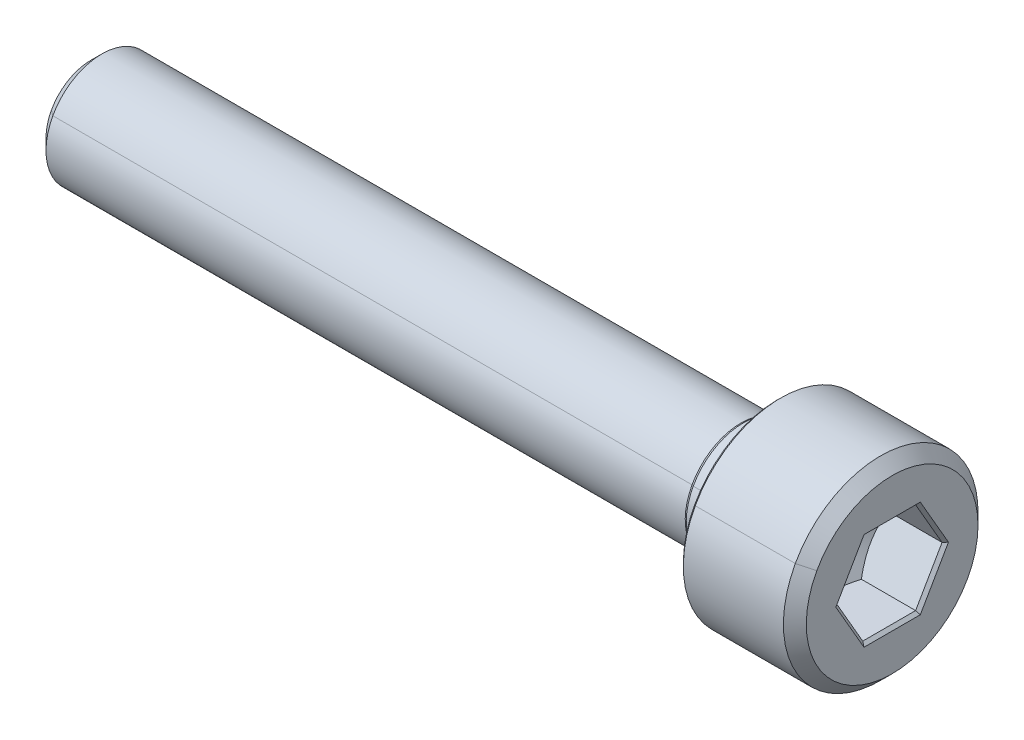
ISO-10303-21;
HEADER;
FILE_DESCRIPTION(('STEP AP214'),'2;1');
FILE_NAME('part.step','',(''),(''),'','','');
FILE_SCHEMA(('AUTOMOTIVE_DESIGN { 1 0 10303 214 1 1 1 1 }'));
ENDSEC;
DATA;
#1=APPLICATION_CONTEXT('core data for automotive mechanical design processes');
#2=APPLICATION_PROTOCOL_DEFINITION('international standard','automotive_design',2000,#1);
#3=PRODUCT_CONTEXT('',#1,'mechanical');
#4=PRODUCT('Part','Part','',(#3));
#5=PRODUCT_RELATED_PRODUCT_CATEGORY('part','',(#4));
#6=PRODUCT_DEFINITION_FORMATION('','',#4);
#7=PRODUCT_DEFINITION_CONTEXT('part definition',#1,'design');
#8=PRODUCT_DEFINITION('design','',#6,#7);
#9=PRODUCT_DEFINITION_SHAPE('','',#8);
#10=(LENGTH_UNIT() NAMED_UNIT(*) SI_UNIT(.MILLI.,.METRE.));
#11=(NAMED_UNIT(*) PLANE_ANGLE_UNIT() SI_UNIT($,.RADIAN.));
#12=(NAMED_UNIT(*) SI_UNIT($,.STERADIAN.) SOLID_ANGLE_UNIT());
#13=UNCERTAINTY_MEASURE_WITH_UNIT(LENGTH_MEASURE(1.E-05),#10,'distance_accuracy_value','');
#14=(GEOMETRIC_REPRESENTATION_CONTEXT(3) GLOBAL_UNCERTAINTY_ASSIGNED_CONTEXT((#13)) GLOBAL_UNIT_ASSIGNED_CONTEXT((#10,
#11,#12)) REPRESENTATION_CONTEXT('',''));
#15=CARTESIAN_POINT('',(0.,0.,0.));
#16=DIRECTION('',(0.,0.,1.));
#17=DIRECTION('',(1.,0.,0.));
#18=AXIS2_PLACEMENT_3D('',#15,#16,#17);
#19=CARTESIAN_POINT('',(5.,5.25,-0.571576766497725));
#20=DIRECTION('',(0.707106781186547,-0.353553390593274,-0.612372435695795));
#21=DIRECTION('',(0.,-0.866025403784439,0.5));
#22=AXIS2_PLACEMENT_3D('',#19,#20,#21);
#23=PLANE('',#22);
#24=DIRECTION('',(-0.654653670707975,0.,-0.755928946018456));
#25=VECTOR('',#24,1.);
#26=CARTESIAN_POINT('',(4.87,0.,2.30940107675851));
#27=LINE('',#26,#25);
#28=CARTESIAN_POINT('',(5.,0.,2.45951214674781));
#29=VERTEX_POINT('',#28);
#30=CARTESIAN_POINT('',(4.87,0.,2.30940107675851));
#31=VERTEX_POINT('',#30);
#32=EDGE_CURVE('E454',#29,#31,#27,.T.);
#33=ORIENTED_EDGE('',*,*,#32,.T.);
#34=DIRECTION('',(0.,-0.866025403784439,0.5));
#35=VECTOR('',#34,1.);
#36=CARTESIAN_POINT('',(4.87,1.,1.73205080756888));
#37=LINE('',#36,#35);
#38=CARTESIAN_POINT('',(4.87,2.,1.15470053837925));
#39=VERTEX_POINT('',#38);
#40=EDGE_CURVE('E375',#39,#31,#37,.T.);
#41=ORIENTED_EDGE('',*,*,#40,.F.);
#42=DIRECTION('',(0.654653670707974,0.654653670707979,0.37796447300923));
#43=VECTOR('',#42,1.);
#44=CARTESIAN_POINT('',(4.87,2.,1.15470053837925));
#45=LINE('',#44,#43);
#46=CARTESIAN_POINT('',(5.,2.13,1.2297560733739));
#47=VERTEX_POINT('',#46);
#48=EDGE_CURVE('E10',#39,#47,#45,.T.);
#49=ORIENTED_EDGE('',*,*,#48,.T.);
#50=DIRECTION('',(0.,-0.866025403784439,0.5));
#51=VECTOR('',#50,1.);
#52=CARTESIAN_POINT('',(5.,1.065,1.84463411006085));
#53=LINE('',#52,#51);
#54=EDGE_CURVE('E361',#47,#29,#53,.T.);
#55=ORIENTED_EDGE('',*,*,#54,.T.);
#56=EDGE_LOOP('',(#33,#41,#49,#55));
#57=FACE_BOUND('',#56,.T.);
#58=ADVANCED_FACE('F15',(#57),#23,.T.);
#59=CARTESIAN_POINT('',(5.,2.13,-5.25));
#60=DIRECTION('',(0.707106781186548,-0.707106781186548,0.));
#61=DIRECTION('',(0.,0.,1.));
#62=AXIS2_PLACEMENT_3D('',#59,#60,#61);
#63=PLANE('',#62);
#64=ORIENTED_EDGE('',*,*,#48,.F.);
#65=DIRECTION('',(0.,0.,1.));
#66=VECTOR('',#65,1.);
#67=CARTESIAN_POINT('',(4.87,2.,0.));
#68=LINE('',#67,#66);
#69=CARTESIAN_POINT('',(4.87,2.,-1.15470053837925));
#70=VERTEX_POINT('',#69);
#71=EDGE_CURVE('E366',#70,#39,#68,.T.);
#72=ORIENTED_EDGE('',*,*,#71,.F.);
#73=DIRECTION('',(0.654653670707974,0.654653670707978,-0.377964473009232));
#74=VECTOR('',#73,1.);
#75=CARTESIAN_POINT('',(4.87,2.,-1.15470053837925));
#76=LINE('',#75,#74);
#77=CARTESIAN_POINT('',(5.,2.13,-1.2297560733739));
#78=VERTEX_POINT('',#77);
#79=EDGE_CURVE('E27',#70,#78,#76,.T.);
#80=ORIENTED_EDGE('',*,*,#79,.T.);
#81=DIRECTION('',(0.,0.,1.));
#82=VECTOR('',#81,1.);
#83=CARTESIAN_POINT('',(5.,2.13,0.));
#84=LINE('',#83,#82);
#85=EDGE_CURVE('E370',#78,#47,#84,.T.);
#86=ORIENTED_EDGE('',*,*,#85,.T.);
#87=EDGE_LOOP('',(#64,#72,#80,#86));
#88=FACE_BOUND('',#87,.T.);
#89=ADVANCED_FACE('F547',(#88),#63,.T.);
#90=CARTESIAN_POINT('',(5.,-4.8332667397366,-5.25));
#91=DIRECTION('',(0.707106781186547,-0.353553390593274,0.612372435695795));
#92=DIRECTION('',(0.,0.866025403784439,0.5));
#93=AXIS2_PLACEMENT_3D('',#90,#91,#92);
#94=PLANE('',#93);
#95=ORIENTED_EDGE('',*,*,#79,.F.);
#96=DIRECTION('',(0.,0.866025403784439,0.5));
#97=VECTOR('',#96,1.);
#98=CARTESIAN_POINT('',(4.87,1.,-1.73205080756888));
#99=LINE('',#98,#97);
#100=CARTESIAN_POINT('',(4.87,0.,-2.30940107675851));
#101=VERTEX_POINT('',#100);
#102=EDGE_CURVE('E348',#101,#70,#99,.T.);
#103=ORIENTED_EDGE('',*,*,#102,.F.);
#104=DIRECTION('',(0.654653670707981,0.,-0.755928946018452));
#105=VECTOR('',#104,1.);
#106=CARTESIAN_POINT('',(4.87,0.,-2.30940107675851));
#107=LINE('',#106,#105);
#108=CARTESIAN_POINT('',(5.,0.,-2.45951214674781));
#109=VERTEX_POINT('',#108);
#110=EDGE_CURVE('E356',#101,#109,#107,.T.);
#111=ORIENTED_EDGE('',*,*,#110,.T.);
#112=DIRECTION('',(0.,0.866025403784439,0.5));
#113=VECTOR('',#112,1.);
#114=CARTESIAN_POINT('',(5.,1.065,-1.84463411006085));
#115=LINE('',#114,#113);
#116=EDGE_CURVE('E354',#109,#78,#115,.T.);
#117=ORIENTED_EDGE('',*,*,#116,.T.);
#118=EDGE_LOOP('',(#95,#103,#111,#117));
#119=FACE_BOUND('',#118,.T.);
#120=ADVANCED_FACE('F551',(#119),#94,.T.);
#121=CARTESIAN_POINT('',(5.,-5.25,0.571576766497726));
#122=DIRECTION('',(0.707106781186547,0.353553390593274,0.612372435695795));
#123=DIRECTION('',(0.,0.866025403784439,-0.5));
#124=AXIS2_PLACEMENT_3D('',#121,#122,#123);
#125=PLANE('',#124);
#126=ORIENTED_EDGE('',*,*,#110,.F.);
#127=DIRECTION('',(0.,0.866025403784439,-0.5));
#128=VECTOR('',#127,1.);
#129=CARTESIAN_POINT('',(4.87,-1.,-1.73205080756887));
#130=LINE('',#129,#128);
#131=CARTESIAN_POINT('',(4.87,-2.,-1.15470053837925));
#132=VERTEX_POINT('',#131);
#133=EDGE_CURVE('E325',#132,#101,#130,.T.);
#134=ORIENTED_EDGE('',*,*,#133,.F.);
#135=DIRECTION('',(0.654653670707973,-0.654653670707982,-0.377964473009227));
#136=VECTOR('',#135,1.);
#137=CARTESIAN_POINT('',(4.87,-2.,-1.15470053837925));
#138=LINE('',#137,#136);
#139=CARTESIAN_POINT('',(5.,-2.13,-1.2297560733739));
#140=VERTEX_POINT('',#139);
#141=EDGE_CURVE('E37',#132,#140,#138,.T.);
#142=ORIENTED_EDGE('',*,*,#141,.T.);
#143=DIRECTION('',(0.,0.866025403784439,-0.5));
#144=VECTOR('',#143,1.);
#145=CARTESIAN_POINT('',(5.,-1.065,-1.84463411006085));
#146=LINE('',#145,#144);
#147=EDGE_CURVE('E252',#140,#109,#146,.T.);
#148=ORIENTED_EDGE('',*,*,#147,.T.);
#149=EDGE_LOOP('',(#126,#134,#142,#148));
#150=FACE_BOUND('',#149,.T.);
#151=ADVANCED_FACE('F17',(#150),#125,.T.);
#152=CARTESIAN_POINT('',(5.,-2.13,5.25));
#153=DIRECTION('',(0.707106781186546,0.707106781186549,0.));
#154=DIRECTION('',(0.,0.,-1.));
#155=AXIS2_PLACEMENT_3D('',#152,#153,#154);
#156=PLANE('',#155);
#157=ORIENTED_EDGE('',*,*,#141,.F.);
#158=DIRECTION('',(0.,0.,-1.));
#159=VECTOR('',#158,1.);
#160=CARTESIAN_POINT('',(4.87,-2.,0.));
#161=LINE('',#160,#159);
#162=CARTESIAN_POINT('',(4.87,-2.,1.15470053837925));
#163=VERTEX_POINT('',#162);
#164=EDGE_CURVE('E326',#163,#132,#161,.T.);
#165=ORIENTED_EDGE('',*,*,#164,.F.);
#166=DIRECTION('',(0.654653670707979,-0.654653670707974,0.37796447300923));
#167=VECTOR('',#166,1.);
#168=CARTESIAN_POINT('',(4.87,-2.,1.15470053837925));
#169=LINE('',#168,#167);
#170=CARTESIAN_POINT('',(5.,-2.13,1.2297560733739));
#171=VERTEX_POINT('',#170);
#172=EDGE_CURVE('E253',#163,#171,#169,.T.);
#173=ORIENTED_EDGE('',*,*,#172,.T.);
#174=DIRECTION('',(0.,0.,-1.));
#175=VECTOR('',#174,1.);
#176=CARTESIAN_POINT('',(5.,-2.13,0.));
#177=LINE('',#176,#175);
#178=EDGE_CURVE('E248',#171,#140,#177,.T.);
#179=ORIENTED_EDGE('',*,*,#178,.T.);
#180=EDGE_LOOP('',(#157,#165,#173,#179));
#181=FACE_BOUND('',#180,.T.);
#182=ADVANCED_FACE('F610',(#181),#156,.T.);
#183=CARTESIAN_POINT('',(5.,4.8332667397366,5.25));
#184=DIRECTION('',(0.707106781186547,0.353553390593274,-0.612372435695795));
#185=DIRECTION('',(0.,-0.866025403784439,-0.5));
#186=AXIS2_PLACEMENT_3D('',#183,#184,#185);
#187=PLANE('',#186);
#188=ORIENTED_EDGE('',*,*,#172,.F.);
#189=DIRECTION('',(0.,-0.866025403784439,-0.5));
#190=VECTOR('',#189,1.);
#191=CARTESIAN_POINT('',(4.87,-1.,1.73205080756887));
#192=LINE('',#191,#190);
#193=EDGE_CURVE('E306',#31,#163,#192,.T.);
#194=ORIENTED_EDGE('',*,*,#193,.F.);
#195=ORIENTED_EDGE('',*,*,#32,.F.);
#196=DIRECTION('',(0.,-0.866025403784439,-0.5));
#197=VECTOR('',#196,1.);
#198=CARTESIAN_POINT('',(5.,-1.065,1.84463411006085));
#199=LINE('',#198,#197);
#200=EDGE_CURVE('E357',#29,#171,#199,.T.);
#201=ORIENTED_EDGE('',*,*,#200,.T.);
#202=EDGE_LOOP('',(#188,#194,#195,#201));
#203=FACE_BOUND('',#202,.T.);
#204=ADVANCED_FACE('F602',(#203),#187,.T.);
#205=CARTESIAN_POINT('',(5.,0.,0.));
#206=DIRECTION('',(-1.,0.,0.));
#207=DIRECTION('',(0.,1.,0.));
#208=AXIS2_PLACEMENT_3D('',#205,#206,#207);
#209=PLANE('',#208);
#210=ORIENTED_EDGE('',*,*,#200,.F.);
#211=ORIENTED_EDGE('',*,*,#54,.F.);
#212=ORIENTED_EDGE('',*,*,#85,.F.);
#213=ORIENTED_EDGE('',*,*,#116,.F.);
#214=ORIENTED_EDGE('',*,*,#147,.F.);
#215=ORIENTED_EDGE('',*,*,#178,.F.);
#216=EDGE_LOOP('',(#210,#211,#212,#213,#214,#215));
#217=FACE_BOUND('',#216,.T.);
#218=CARTESIAN_POINT('',(5.,0.,0.));
#219=DIRECTION('',(-1.,0.,0.));
#220=DIRECTION('',(0.,1.,0.));
#221=AXIS2_PLACEMENT_3D('',#218,#219,#220);
#222=CIRCLE('',#221,3.75);
#223=CARTESIAN_POINT('',(5.,-1.79784576976576,-3.29093460708889));
#224=VERTEX_POINT('',#223);
#225=CARTESIAN_POINT('',(5.,1.79784576976576,3.29093460708889));
#226=VERTEX_POINT('',#225);
#227=EDGE_CURVE('E406',#224,#226,#222,.T.);
#228=ORIENTED_EDGE('',*,*,#227,.F.);
#229=CARTESIAN_POINT('',(5.,0.,0.));
#230=DIRECTION('',(-1.,0.,0.));
#231=DIRECTION('',(0.,1.,0.));
#232=AXIS2_PLACEMENT_3D('',#229,#230,#231);
#233=CIRCLE('',#232,3.75);
#234=EDGE_CURVE('E468',#226,#224,#233,.T.);
#235=ORIENTED_EDGE('',*,*,#234,.F.);
#236=EDGE_LOOP('',(#228,#235));
#237=FACE_BOUND('',#236,.T.);
#238=ADVANCED_FACE('F607',(#217,#237),#209,.F.);
#239=CARTESIAN_POINT('',(5.,-2.,1.15470053837925));
#240=DIRECTION('',(0.,1.,0.));
#241=DIRECTION('',(0.,0.,-1.));
#242=AXIS2_PLACEMENT_3D('',#239,#240,#241);
#243=PLANE('',#242);
#244=DIRECTION('',(-1.,0.,0.));
#245=VECTOR('',#244,1.);
#246=CARTESIAN_POINT('',(3.685,-2.,-1.15470053837925));
#247=LINE('',#246,#245);
#248=CARTESIAN_POINT('',(2.5,-2.,-1.15470053837925));
#249=VERTEX_POINT('',#248);
#250=EDGE_CURVE('E330',#132,#249,#247,.T.);
#251=ORIENTED_EDGE('',*,*,#250,.T.);
#252=CARTESIAN_POINT('',(2.5,-2.,-1.15470053837925));
#253=CARTESIAN_POINT('',(2.43948013497173,-2.,-0.945053576186914));
#254=CARTESIAN_POINT('',(2.39611898453559,-2.,-0.759161721789873));
#255=CARTESIAN_POINT('',(2.36471291003908,-2.,-0.587152600071871));
#256=CARTESIAN_POINT('',(2.31869436819489,-2.,-0.233518967026137));
#257=CARTESIAN_POINT('',(2.31591308688858,-2.,0.100926377531076));
#258=CARTESIAN_POINT('',(2.32566489400862,-2.,0.280695643399948));
#259=CARTESIAN_POINT('',(2.35686814678756,-2.,0.549787028674269));
#260=CARTESIAN_POINT('',(2.42000103660406,-2.,0.850739171147073));
#261=CARTESIAN_POINT('',(2.44267513793958,-2.,0.946819617366732));
#262=CARTESIAN_POINT('',(2.46910120829587,-2.,1.04766398413119));
#263=CARTESIAN_POINT('',(2.5,-2.,1.15470053837925));
#264=(BOUNDED_CURVE() B_SPLINE_CURVE(5,(#252,#253,#254,#255,#256,#257,#258,#259,#260,#261,#262,
#263),.UNSPECIFIED.,.F.,.F.) B_SPLINE_CURVE_WITH_KNOTS((6,3,3,6),(0.,39.3286004177827,
84.7348041094652,104.814264494186),
.UNSPECIFIED.) CURVE() GEOMETRIC_REPRESENTATION_ITEM() RATIONAL_B_SPLINE_CURVE((1.,1.,1.,1.,1.,
1.,1.,1.,1.,1.,1.,1.)) REPRESENTATION_ITEM(''));
#265=CARTESIAN_POINT('',(2.5,-2.,1.15470053837925));
#266=VERTEX_POINT('',#265);
#267=EDGE_CURVE('E269',#249,#266,#264,.T.);
#268=ORIENTED_EDGE('',*,*,#267,.T.);
#269=DIRECTION('',(-1.,0.,0.));
#270=VECTOR('',#269,1.);
#271=CARTESIAN_POINT('',(3.685,-2.,1.15470053837925));
#272=LINE('',#271,#270);
#273=EDGE_CURVE('E321',#163,#266,#272,.T.);
#274=ORIENTED_EDGE('',*,*,#273,.F.);
#275=ORIENTED_EDGE('',*,*,#164,.T.);
#276=EDGE_LOOP('',(#251,#268,#274,#275));
#277=FACE_BOUND('',#276,.T.);
#278=ADVANCED_FACE('F572',(#277),#243,.T.);
#279=CARTESIAN_POINT('',(5.,-2.,-1.15470053837925));
#280=DIRECTION('',(0.,0.5,0.866025403784439));
#281=DIRECTION('',(0.,0.866025403784439,-0.5));
#282=AXIS2_PLACEMENT_3D('',#279,#280,#281);
#283=PLANE('',#282);
#284=DIRECTION('',(-1.,0.,0.));
#285=VECTOR('',#284,1.);
#286=CARTESIAN_POINT('',(3.685,0.,-2.30940107675851));
#287=LINE('',#286,#285);
#288=CARTESIAN_POINT('',(2.5,0.,-2.30940107675851));
#289=VERTEX_POINT('',#288);
#290=EDGE_CURVE('E383',#101,#289,#287,.T.);
#291=ORIENTED_EDGE('',*,*,#290,.T.);
#292=CARTESIAN_POINT('',(2.5,0.,-2.30940107675851));
#293=CARTESIAN_POINT('',(2.43948013497474,-0.181559595075749,-2.20457759566756));
#294=CARTESIAN_POINT('',(2.39611898454059,-0.342546663335509,-2.11163166847174));
#295=CARTESIAN_POINT('',(2.36471291003259,-0.491510932453845,-2.02562710759663));
#296=CARTESIAN_POINT('',(2.31869436820212,-0.797766642281535,-1.84881029108675));
#297=CARTESIAN_POINT('',(2.31591308688305,-1.08740480682542,-1.68158761881975));
#298=CARTESIAN_POINT('',(2.32566489401169,-1.24308955794247,-1.5917029858536));
#299=CARTESIAN_POINT('',(2.35686814679197,-1.476129533521,-1.4571572932214));
#300=CARTESIAN_POINT('',(2.42000103660388,-1.73676173420727,-1.30668122199569));
#301=CARTESIAN_POINT('',(2.44267513793853,-1.81996984144166,-1.25864099888516));
#302=CARTESIAN_POINT('',(2.46910120829587,-1.90730362488763,-1.20821881550328));
#303=CARTESIAN_POINT('',(2.5,-2.,-1.15470053837925));
#304=(BOUNDED_CURVE() B_SPLINE_CURVE(5,(#292,#293,#294,#295,#296,#297,#298,#299,#300,#301,#302,
#303),.UNSPECIFIED.,.F.,.F.) B_SPLINE_CURVE_WITH_KNOTS((6,3,3,6),(0.,39.3286004158223,
84.7348041033463,104.814264488068),
.UNSPECIFIED.) CURVE() GEOMETRIC_REPRESENTATION_ITEM() RATIONAL_B_SPLINE_CURVE((1.,1.,1.,1.,1.,
1.,1.,1.,1.,1.,1.,1.)) REPRESENTATION_ITEM(''));
#305=EDGE_CURVE('E327',#289,#249,#304,.T.);
#306=ORIENTED_EDGE('',*,*,#305,.T.);
#307=ORIENTED_EDGE('',*,*,#250,.F.);
#308=ORIENTED_EDGE('',*,*,#133,.T.);
#309=EDGE_LOOP('',(#291,#306,#307,#308));
#310=FACE_BOUND('',#309,.T.);
#311=ADVANCED_FACE('F567',(#310),#283,.T.);
#312=CARTESIAN_POINT('',(5.,2.,-1.15470053837925));
#313=DIRECTION('',(0.,-1.,0.));
#314=DIRECTION('',(0.,0.,1.));
#315=AXIS2_PLACEMENT_3D('',#312,#313,#314);
#316=PLANE('',#315);
#317=DIRECTION('',(-1.,0.,0.));
#318=VECTOR('',#317,1.);
#319=CARTESIAN_POINT('',(3.685,2.,1.15470053837925));
#320=LINE('',#319,#318);
#321=CARTESIAN_POINT('',(2.5,2.,1.15470053837925));
#322=VERTEX_POINT('',#321);
#323=EDGE_CURVE('E315',#39,#322,#320,.T.);
#324=ORIENTED_EDGE('',*,*,#323,.T.);
#325=CARTESIAN_POINT('',(2.5,2.,1.15470053837925));
#326=CARTESIAN_POINT('',(2.43948013497239,2.,0.945053576189195));
#327=CARTESIAN_POINT('',(2.39611898453922,2.,0.759161721799283));
#328=CARTESIAN_POINT('',(2.36471291003425,2.,0.587152600065618));
#329=CARTESIAN_POINT('',(2.3186943682013,2.,0.233518967038204));
#330=CARTESIAN_POINT('',(2.31591308688294,2.,-0.100926377514494));
#331=CARTESIAN_POINT('',(2.32566489401195,2.,-0.280695643424511));
#332=CARTESIAN_POINT('',(2.35686814678962,2.,-0.549787028684423));
#333=CARTESIAN_POINT('',(2.42000103660423,2.,-0.850739171147772));
#334=CARTESIAN_POINT('',(2.44267513793958,2.,-0.946819617367431));
#335=CARTESIAN_POINT('',(2.46910120829587,2.,-1.04766398413119));
#336=CARTESIAN_POINT('',(2.5,2.,-1.15470053837925));
#337=(BOUNDED_CURVE() B_SPLINE_CURVE(5,(#325,#326,#327,#328,#329,#330,#331,#332,#333,#334,#335,
#336),.UNSPECIFIED.,.F.,.F.) B_SPLINE_CURVE_WITH_KNOTS((6,3,3,6),(0.,39.3286004173548,
84.7348041064837,104.814264491205),
.UNSPECIFIED.) CURVE() GEOMETRIC_REPRESENTATION_ITEM() RATIONAL_B_SPLINE_CURVE((1.,1.,1.,1.,1.,
1.,1.,1.,1.,1.,1.,1.)) REPRESENTATION_ITEM(''));
#338=CARTESIAN_POINT('',(2.5,2.,-1.15470053837925));
#339=VERTEX_POINT('',#338);
#340=EDGE_CURVE('E278',#322,#339,#337,.T.);
#341=ORIENTED_EDGE('',*,*,#340,.T.);
#342=DIRECTION('',(-1.,0.,0.));
#343=VECTOR('',#342,1.);
#344=CARTESIAN_POINT('',(3.685,2.,-1.15470053837925));
#345=LINE('',#344,#343);
#346=EDGE_CURVE('E390',#70,#339,#345,.T.);
#347=ORIENTED_EDGE('',*,*,#346,.F.);
#348=ORIENTED_EDGE('',*,*,#71,.T.);
#349=EDGE_LOOP('',(#324,#341,#347,#348));
#350=FACE_BOUND('',#349,.T.);
#351=ADVANCED_FACE('F564',(#350),#316,.T.);
#352=CARTESIAN_POINT('',(5.,2.,1.15470053837925));
#353=DIRECTION('',(0.,-0.5,-0.866025403784439));
#354=DIRECTION('',(0.,-0.866025403784439,0.5));
#355=AXIS2_PLACEMENT_3D('',#352,#353,#354);
#356=PLANE('',#355);
#357=DIRECTION('',(-1.,0.,0.));
#358=VECTOR('',#357,1.);
#359=CARTESIAN_POINT('',(3.685,0.,2.30940107675851));
#360=LINE('',#359,#358);
#361=CARTESIAN_POINT('',(2.5,0.,2.30940107675851));
#362=VERTEX_POINT('',#361);
#363=EDGE_CURVE('E311',#31,#362,#360,.T.);
#364=ORIENTED_EDGE('',*,*,#363,.T.);
#365=CARTESIAN_POINT('',(2.5,0.,2.30940107675851));
#366=CARTESIAN_POINT('',(2.43948013496849,0.181559595094497,2.20457759565674));
#367=CARTESIAN_POINT('',(2.39611898453096,0.342546663368755,2.11163166845255));
#368=CARTESIAN_POINT('',(2.36471291004505,0.491510932419843,2.02562710761626));
#369=CARTESIAN_POINT('',(2.31869436818894,0.797766642299729,1.84881029107625));
#370=CARTESIAN_POINT('',(2.31591308689329,1.08740480686975,1.68158761879416));
#371=CARTESIAN_POINT('',(2.32566489400554,1.24308955789607,1.59170298588039));
#372=CARTESIAN_POINT('',(2.35686814678445,1.47612953348885,1.45715729323996));
#373=CARTESIAN_POINT('',(2.42000103660406,1.73676173420848,1.30668122199499));
#374=CARTESIAN_POINT('',(2.44267513793923,1.81996984144165,1.25864099888516));
#375=CARTESIAN_POINT('',(2.46910120829587,1.90730362488763,1.20821881550328));
#376=CARTESIAN_POINT('',(2.5,2.,1.15470053837925));
#377=(BOUNDED_CURVE() B_SPLINE_CURVE(5,(#365,#366,#367,#368,#369,#370,#371,#372,#373,#374,#375,
#376),.UNSPECIFIED.,.F.,.F.) B_SPLINE_CURVE_WITH_KNOTS((6,3,3,6),(0.,39.3286004198833,
84.7348041147972,104.814264499518),
.UNSPECIFIED.) CURVE() GEOMETRIC_REPRESENTATION_ITEM() RATIONAL_B_SPLINE_CURVE((1.,1.,1.,1.,1.,
1.,1.,1.,1.,1.,1.,1.)) REPRESENTATION_ITEM(''));
#378=EDGE_CURVE('E257',#362,#322,#377,.T.);
#379=ORIENTED_EDGE('',*,*,#378,.T.);
#380=ORIENTED_EDGE('',*,*,#323,.F.);
#381=ORIENTED_EDGE('',*,*,#40,.T.);
#382=EDGE_LOOP('',(#364,#379,#380,#381));
#383=FACE_BOUND('',#382,.T.);
#384=ADVANCED_FACE('F568',(#383),#356,.T.);
#385=CARTESIAN_POINT('',(5.,0.,2.30940107675851));
#386=DIRECTION('',(0.,0.5,-0.866025403784439));
#387=DIRECTION('',(0.,-0.866025403784439,-0.5));
#388=AXIS2_PLACEMENT_3D('',#385,#386,#387);
#389=PLANE('',#388);
#390=ORIENTED_EDGE('',*,*,#273,.T.);
#391=CARTESIAN_POINT('',(2.32168880731162,-0.959118132318074,1.75565396488001));
#392=CARTESIAN_POINT('',(2.31983158418195,-1.0771790576668,1.68749145784915));
#393=CARTESIAN_POINT('',(2.32468232814425,-1.19476574490747,1.61960275231764));
#394=CARTESIAN_POINT('',(2.3361523277153,-1.31402811242594,1.55074659232665));
#395=CARTESIAN_POINT('',(2.3660186453345,-1.51228838865196,1.43628096847795));
#396=CARTESIAN_POINT('',(2.41799566671797,-1.72937656586716,1.31094505092487));
#397=CARTESIAN_POINT('',(2.44111304668886,-1.8147991193211,1.26162631669337));
#398=CARTESIAN_POINT('',(2.46818567175783,-1.90455701527352,1.20980457130335));
#399=CARTESIAN_POINT('',(2.5,-2.,1.15470053837925));
#400=(BOUNDED_CURVE() B_SPLINE_CURVE(5,(#391,#392,#393,#394,#395,#396,#397,#398,#399),
.UNSPECIFIED.,.F.,.F.) B_SPLINE_CURVE_WITH_KNOTS((6,3,6),(0.,34.0691028062919,54.7435210722878),
.UNSPECIFIED.) CURVE() GEOMETRIC_REPRESENTATION_ITEM() RATIONAL_B_SPLINE_CURVE((1.,1.,1.,1.,1.,
1.,1.,1.,1.)) REPRESENTATION_ITEM(''));
#401=CARTESIAN_POINT('',(2.32168880731162,-0.959118132318073,1.75565396488002));
#402=VERTEX_POINT('',#401);
#403=EDGE_CURVE('E261',#402,#266,#400,.T.);
#404=ORIENTED_EDGE('',*,*,#403,.F.);
#405=CARTESIAN_POINT('',(2.32168880731162,-0.959118132318073,1.75565396488002));
#406=CARTESIAN_POINT('',(2.32352648717678,-0.842299543367737,1.82309920865684));
#407=CARTESIAN_POINT('',(2.33193170378819,-0.72501663461094,1.89081252759892));
#408=CARTESIAN_POINT('',(2.34698721040078,-0.605201113749468,1.95998805082138));
#409=CARTESIAN_POINT('',(2.38016778094994,-0.419902448368499,2.06697028515957));
#410=CARTESIAN_POINT('',(2.43316069981738,-0.215971258808317,2.1847100123483));
#411=CARTESIAN_POINT('',(2.45274650360308,-0.147077382596166,2.2244859103249));
#412=CARTESIAN_POINT('',(2.47489719389229,-0.0753084183231064,2.26592174116742));
#413=CARTESIAN_POINT('',(2.5,0.,2.30940107675851));
#414=(BOUNDED_CURVE() B_SPLINE_CURVE(5,(#405,#406,#407,#408,#409,#410,#411,#412,#413),
.UNSPECIFIED.,.F.,.F.) B_SPLINE_CURVE_WITH_KNOTS((6,3,6),(0.,33.7105990392597,50.0235605819496),
.UNSPECIFIED.) CURVE() GEOMETRIC_REPRESENTATION_ITEM() RATIONAL_B_SPLINE_CURVE((1.,1.,1.,1.,1.,
1.,1.,1.,1.)) REPRESENTATION_ITEM(''));
#415=EDGE_CURVE('E251',#402,#362,#414,.T.);
#416=ORIENTED_EDGE('',*,*,#415,.T.);
#417=ORIENTED_EDGE('',*,*,#363,.F.);
#418=ORIENTED_EDGE('',*,*,#193,.T.);
#419=EDGE_LOOP('',(#390,#404,#416,#417,#418));
#420=FACE_BOUND('',#419,.T.);
#421=ADVANCED_FACE('F598',(#420),#389,.T.);
#422=CARTESIAN_POINT('',(5.,0.,-2.30940107675851));
#423=DIRECTION('',(0.,-0.5,0.866025403784439));
#424=DIRECTION('',(0.,0.866025403784439,0.5));
#425=AXIS2_PLACEMENT_3D('',#422,#423,#424);
#426=PLANE('',#425);
#427=ORIENTED_EDGE('',*,*,#346,.T.);
#428=CARTESIAN_POINT('',(2.32168880731162,0.959118132318072,-1.75565396488002));
#429=CARTESIAN_POINT('',(2.31983158418225,1.07717905764734,-1.68749145786039));
#430=CARTESIAN_POINT('',(2.32468232813979,1.19476574486347,-1.61960275234303));
#431=CARTESIAN_POINT('',(2.3361523277169,1.31402811245964,-1.5507465923072));
#432=CARTESIAN_POINT('',(2.36601864534257,1.51228838867846,-1.43628096846265));
#433=CARTESIAN_POINT('',(2.41799566671629,1.72937656586459,-1.31094505092635));
#434=CARTESIAN_POINT('',(2.44111304668644,1.81479911931918,-1.26162631669448));
#435=CARTESIAN_POINT('',(2.46818567175783,1.90455701527352,-1.20980457130335));
#436=CARTESIAN_POINT('',(2.5,2.,-1.15470053837925));
#437=(BOUNDED_CURVE() B_SPLINE_CURVE(5,(#428,#429,#430,#431,#432,#433,#434,#435,#436),
.UNSPECIFIED.,.F.,.F.) B_SPLINE_CURVE_WITH_KNOTS((6,3,6),(0.,34.0691028006767,54.7435210666726),
.UNSPECIFIED.) CURVE() GEOMETRIC_REPRESENTATION_ITEM() RATIONAL_B_SPLINE_CURVE((1.,1.,1.,1.,1.,
1.,1.,1.,1.)) REPRESENTATION_ITEM(''));
#438=CARTESIAN_POINT('',(2.32168880731162,0.959118132318073,-1.75565396488002));
#439=VERTEX_POINT('',#438);
#440=EDGE_CURVE('E331',#439,#339,#437,.T.);
#441=ORIENTED_EDGE('',*,*,#440,.F.);
#442=CARTESIAN_POINT('',(2.32168880731162,0.959118132318073,-1.75565396488002));
#443=CARTESIAN_POINT('',(2.32352648717635,0.842299543395304,-1.82309920864093));
#444=CARTESIAN_POINT('',(2.33193170377915,0.725016634659464,-1.89081252757091));
#445=CARTESIAN_POINT('',(2.34698721040543,0.605201113688824,-1.9599880508564));
#446=CARTESIAN_POINT('',(2.38016778096122,0.419902448336894,-2.06697028517782));
#447=CARTESIAN_POINT('',(2.43316069981599,0.215971258807917,-2.18471001234853));
#448=CARTESIAN_POINT('',(2.45274650360528,0.147077382594566,-2.22448591032582));
#449=CARTESIAN_POINT('',(2.47489719389229,0.0753084183231065,-2.26592174116742));
#450=CARTESIAN_POINT('',(2.5,0.,-2.30940107675851));
#451=(BOUNDED_CURVE() B_SPLINE_CURVE(5,(#442,#443,#444,#445,#446,#447,#448,#449,#450),
.UNSPECIFIED.,.F.,.F.) B_SPLINE_CURVE_WITH_KNOTS((6,3,6),(0.,33.7105990313047,50.0235605739944),
.UNSPECIFIED.) CURVE() GEOMETRIC_REPRESENTATION_ITEM() RATIONAL_B_SPLINE_CURVE((1.,1.,1.,1.,1.,
1.,1.,1.,1.)) REPRESENTATION_ITEM(''));
#452=EDGE_CURVE('E271',#439,#289,#451,.T.);
#453=ORIENTED_EDGE('',*,*,#452,.T.);
#454=ORIENTED_EDGE('',*,*,#290,.F.);
#455=ORIENTED_EDGE('',*,*,#102,.T.);
#456=EDGE_LOOP('',(#427,#441,#453,#454,#455));
#457=FACE_BOUND('',#456,.T.);
#458=ADVANCED_FACE('F592',(#457),#426,.T.);
#459=CARTESIAN_POINT('',(5.,0.,0.));
#460=DIRECTION('',(-1.,0.,0.));
#461=DIRECTION('',(0.,1.,0.));
#462=AXIS2_PLACEMENT_3D('',#459,#460,#461);
#463=CONICAL_SURFACE('',#462,3.75,0.785398163397448);
#464=DIRECTION('',(-0.707106781186548,-0.339005049421044,-0.620544580563746));
#465=VECTOR('',#464,1.);
#466=CARTESIAN_POINT('',(4.75,-1.91770215441679,-3.51033024756146));
#467=LINE('',#466,#465);
#468=CARTESIAN_POINT('',(4.50000000000006,-2.03755853906783,-3.72972588803403));
#469=VERTEX_POINT('',#468);
#470=EDGE_CURVE('E382',#224,#469,#467,.T.);
#471=ORIENTED_EDGE('',*,*,#470,.T.);
#472=CARTESIAN_POINT('',(4.50000000000006,0.,0.));
#473=DIRECTION('',(-1.,0.,0.));
#474=DIRECTION('',(0.,1.,0.));
#475=AXIS2_PLACEMENT_3D('',#472,#473,#474);
#476=CIRCLE('',#475,4.24999999999994);
#477=CARTESIAN_POINT('',(4.50000000000006,2.03755853906783,3.72972588803403));
#478=VERTEX_POINT('',#477);
#479=EDGE_CURVE('E206',#478,#469,#476,.T.);
#480=ORIENTED_EDGE('',*,*,#479,.F.);
#481=DIRECTION('',(-0.707106781186548,0.339005049421044,0.620544580563746));
#482=VECTOR('',#481,1.);
#483=CARTESIAN_POINT('',(4.75,1.91770215441679,3.51033024756146));
#484=LINE('',#483,#482);
#485=EDGE_CURVE('E379',#226,#478,#484,.T.);
#486=ORIENTED_EDGE('',*,*,#485,.F.);
#487=ORIENTED_EDGE('',*,*,#234,.T.);
#488=EDGE_LOOP('',(#471,#480,#486,#487));
#489=FACE_BOUND('',#488,.T.);
#490=ADVANCED_FACE('F600',(#489),#463,.T.);
#491=CARTESIAN_POINT('',(5.,0.,0.));
#492=DIRECTION('',(-1.,0.,0.));
#493=DIRECTION('',(0.,1.,0.));
#494=AXIS2_PLACEMENT_3D('',#491,#492,#493);
#495=CONICAL_SURFACE('',#494,3.75,0.785398163397448);
#496=ORIENTED_EDGE('',*,*,#485,.T.);
#497=CARTESIAN_POINT('',(4.50000000000006,0.,0.));
#498=DIRECTION('',(-1.,0.,0.));
#499=DIRECTION('',(0.,1.,0.));
#500=AXIS2_PLACEMENT_3D('',#497,#498,#499);
#501=CIRCLE('',#500,4.24999999999994);
#502=EDGE_CURVE('E215',#469,#478,#501,.T.);
#503=ORIENTED_EDGE('',*,*,#502,.F.);
#504=ORIENTED_EDGE('',*,*,#470,.F.);
#505=ORIENTED_EDGE('',*,*,#227,.T.);
#506=EDGE_LOOP('',(#496,#503,#504,#505));
#507=FACE_BOUND('',#506,.T.);
#508=ADVANCED_FACE('F580',(#507),#495,.T.);
#509=CARTESIAN_POINT('',(-12.5,0.,0.));
#510=DIRECTION('',(1.,0.,0.));
#511=DIRECTION('',(0.,1.,0.));
#512=AXIS2_PLACEMENT_3D('',#509,#510,#511);
#513=CYLINDRICAL_SURFACE('',#512,4.25);
#514=DIRECTION('',(-1.,0.,0.));
#515=VECTOR('',#514,1.);
#516=CARTESIAN_POINT('',(2.315,-2.03755853906786,-3.72972588803409));
#517=LINE('',#516,#515);
#518=CARTESIAN_POINT('',(0.129999999999997,-2.03755853906786,-3.72972588803409));
#519=VERTEX_POINT('',#518);
#520=EDGE_CURVE('E196',#469,#519,#517,.T.);
#521=ORIENTED_EDGE('',*,*,#520,.T.);
#522=CARTESIAN_POINT('',(0.129999999999995,0.,0.));
#523=DIRECTION('',(-1.,0.,0.));
#524=DIRECTION('',(0.,1.,0.));
#525=AXIS2_PLACEMENT_3D('',#522,#523,#524);
#526=CIRCLE('',#525,4.25);
#527=CARTESIAN_POINT('',(0.129999999999997,2.03755853906786,3.72972588803409));
#528=VERTEX_POINT('',#527);
#529=EDGE_CURVE('E201',#528,#519,#526,.T.);
#530=ORIENTED_EDGE('',*,*,#529,.F.);
#531=DIRECTION('',(-1.,0.,0.));
#532=VECTOR('',#531,1.);
#533=CARTESIAN_POINT('',(2.315,2.03755853906786,3.72972588803409));
#534=LINE('',#533,#532);
#535=EDGE_CURVE('E19',#478,#528,#534,.T.);
#536=ORIENTED_EDGE('',*,*,#535,.F.);
#537=ORIENTED_EDGE('',*,*,#479,.T.);
#538=EDGE_LOOP('',(#521,#530,#536,#537));
#539=FACE_BOUND('',#538,.T.);
#540=ADVANCED_FACE('F203',(#539),#513,.T.);
#541=CARTESIAN_POINT('',(-12.5,0.,0.));
#542=DIRECTION('',(1.,0.,0.));
#543=DIRECTION('',(0.,1.,0.));
#544=AXIS2_PLACEMENT_3D('',#541,#542,#543);
#545=CYLINDRICAL_SURFACE('',#544,4.25);
#546=ORIENTED_EDGE('',*,*,#535,.T.);
#547=CARTESIAN_POINT('',(0.129999999999995,0.,0.));
#548=DIRECTION('',(-1.,0.,0.));
#549=DIRECTION('',(0.,1.,0.));
#550=AXIS2_PLACEMENT_3D('',#547,#548,#549);
#551=CIRCLE('',#550,4.25);
#552=EDGE_CURVE('E221',#519,#528,#551,.T.);
#553=ORIENTED_EDGE('',*,*,#552,.F.);
#554=ORIENTED_EDGE('',*,*,#520,.F.);
#555=ORIENTED_EDGE('',*,*,#502,.T.);
#556=EDGE_LOOP('',(#546,#553,#554,#555));
#557=FACE_BOUND('',#556,.T.);
#558=ADVANCED_FACE('F227',(#557),#545,.T.);
#559=CARTESIAN_POINT('',(0.,0.,0.));
#560=DIRECTION('',(1.,0.,0.));
#561=DIRECTION('',(0.,1.,0.));
#562=AXIS2_PLACEMENT_3D('',#559,#560,#561);
#563=CONICAL_SURFACE('',#562,4.12,0.785398163397448);
#564=DIRECTION('',(-0.707106781186549,0.339005049421044,0.620544580563744));
#565=VECTOR('',#564,1.);
#566=CARTESIAN_POINT('',(0.0649999999999962,-2.00639587905859,-3.67268302151121));
#567=LINE('',#566,#565);
#568=CARTESIAN_POINT('',(0.,-1.97523321904931,-3.61564015498834));
#569=VERTEX_POINT('',#568);
#570=EDGE_CURVE('E219',#519,#569,#567,.T.);
#571=ORIENTED_EDGE('',*,*,#570,.T.);
#572=CARTESIAN_POINT('',(0.,0.,0.));
#573=DIRECTION('',(-1.,0.,0.));
#574=DIRECTION('',(0.,1.,0.));
#575=AXIS2_PLACEMENT_3D('',#572,#573,#574);
#576=CIRCLE('',#575,4.12);
#577=CARTESIAN_POINT('',(0.,1.97523321904931,3.61564015498834));
#578=VERTEX_POINT('',#577);
#579=EDGE_CURVE('E420',#578,#569,#576,.T.);
#580=ORIENTED_EDGE('',*,*,#579,.F.);
#581=DIRECTION('',(-0.707106781186549,-0.339005049421044,-0.620544580563744));
#582=VECTOR('',#581,1.);
#583=CARTESIAN_POINT('',(0.0649999999999962,2.00639587905859,3.67268302151121));
#584=LINE('',#583,#582);
#585=EDGE_CURVE('E225',#528,#578,#584,.T.);
#586=ORIENTED_EDGE('',*,*,#585,.F.);
#587=ORIENTED_EDGE('',*,*,#529,.T.);
#588=EDGE_LOOP('',(#571,#580,#586,#587));
#589=FACE_BOUND('',#588,.T.);
#590=ADVANCED_FACE('F220',(#589),#563,.T.);
#591=CARTESIAN_POINT('',(0.,0.,0.));
#592=DIRECTION('',(1.,0.,0.));
#593=DIRECTION('',(0.,1.,0.));
#594=AXIS2_PLACEMENT_3D('',#591,#592,#593);
#595=CONICAL_SURFACE('',#594,4.12,0.785398163397448);
#596=ORIENTED_EDGE('',*,*,#585,.T.);
#597=CARTESIAN_POINT('',(0.,0.,0.));
#598=DIRECTION('',(-1.,0.,0.));
#599=DIRECTION('',(0.,1.,0.));
#600=AXIS2_PLACEMENT_3D('',#597,#598,#599);
#601=CIRCLE('',#600,4.12);
#602=EDGE_CURVE('E234',#569,#578,#601,.T.);
#603=ORIENTED_EDGE('',*,*,#602,.F.);
#604=ORIENTED_EDGE('',*,*,#570,.F.);
#605=ORIENTED_EDGE('',*,*,#552,.T.);
#606=EDGE_LOOP('',(#596,#603,#604,#605));
#607=FACE_BOUND('',#606,.T.);
#608=ADVANCED_FACE('F233',(#607),#595,.T.);
#609=CARTESIAN_POINT('',(-0.200000000000004,0.,0.));
#610=DIRECTION('',(-1.,0.,0.));
#611=DIRECTION('',(0.,1.,0.));
#612=AXIS2_PLACEMENT_3D('',#609,#610,#611);
#613=TOROIDAL_SURFACE('',#612,2.7,0.2);
#614=CARTESIAN_POINT('',(-0.200000000000004,-1.29444895423135,-2.369472917104));
#615=DIRECTION('',(0.,-0.877582561890372,0.479425538604204));
#616=DIRECTION('',(0.,-0.479425538604204,-0.877582561890372));
#617=AXIS2_PLACEMENT_3D('',#614,#615,#616);
#618=CIRCLE('',#617,0.2);
#619=CARTESIAN_POINT('',(0.,-1.29444895423135,-2.369472917104));
#620=VERTEX_POINT('',#619);
#621=CARTESIAN_POINT('',(-0.200000000000004,-1.19856384651051,-2.19395640472593));
#622=VERTEX_POINT('',#621);
#623=EDGE_CURVE('E245',#620,#622,#618,.T.);
#624=ORIENTED_EDGE('',*,*,#623,.T.);
#625=CARTESIAN_POINT('',(-0.200000000000004,0.,0.));
#626=DIRECTION('',(-1.,0.,0.));
#627=DIRECTION('',(0.,1.,0.));
#628=AXIS2_PLACEMENT_3D('',#625,#626,#627);
#629=CIRCLE('',#628,2.5);
#630=CARTESIAN_POINT('',(-0.200000000000004,1.19856384651051,2.19395640472593));
#631=VERTEX_POINT('',#630);
#632=EDGE_CURVE('E345',#631,#622,#629,.T.);
#633=ORIENTED_EDGE('',*,*,#632,.F.);
#634=CARTESIAN_POINT('',(-0.200000000000004,1.29444895423135,2.36947291710401));
#635=DIRECTION('',(0.,0.877582561890373,-0.479425538604203));
#636=DIRECTION('',(0.,0.479425538604203,0.877582561890373));
#637=AXIS2_PLACEMENT_3D('',#634,#635,#636);
#638=CIRCLE('',#637,0.2);
#639=CARTESIAN_POINT('',(0.,1.29444895423135,2.369472917104));
#640=VERTEX_POINT('',#639);
#641=EDGE_CURVE('E421',#640,#631,#638,.T.);
#642=ORIENTED_EDGE('',*,*,#641,.F.);
#643=CARTESIAN_POINT('',(0.,0.,0.));
#644=DIRECTION('',(-1.,0.,0.));
#645=DIRECTION('',(0.,1.,0.));
#646=AXIS2_PLACEMENT_3D('',#643,#644,#645);
#647=CIRCLE('',#646,2.7);
#648=EDGE_CURVE('E423',#640,#620,#647,.T.);
#649=ORIENTED_EDGE('',*,*,#648,.T.);
#650=EDGE_LOOP('',(#624,#633,#642,#649));
#651=FACE_BOUND('',#650,.T.);
#652=ADVANCED_FACE('F582',(#651),#613,.F.);
#653=CARTESIAN_POINT('',(-0.200000000000004,0.,0.));
#654=DIRECTION('',(-1.,0.,0.));
#655=DIRECTION('',(0.,1.,0.));
#656=AXIS2_PLACEMENT_3D('',#653,#654,#655);
#657=TOROIDAL_SURFACE('',#656,2.7,0.2);
#658=ORIENTED_EDGE('',*,*,#641,.T.);
#659=CARTESIAN_POINT('',(-0.200000000000004,0.,0.));
#660=DIRECTION('',(-1.,0.,0.));
#661=DIRECTION('',(0.,1.,0.));
#662=AXIS2_PLACEMENT_3D('',#659,#660,#661);
#663=CIRCLE('',#662,2.5);
#664=EDGE_CURVE('E333',#622,#631,#663,.T.);
#665=ORIENTED_EDGE('',*,*,#664,.F.);
#666=ORIENTED_EDGE('',*,*,#623,.F.);
#667=CARTESIAN_POINT('',(0.,0.,0.));
#668=DIRECTION('',(-1.,0.,0.));
#669=DIRECTION('',(0.,1.,0.));
#670=AXIS2_PLACEMENT_3D('',#667,#668,#669);
#671=CIRCLE('',#670,2.7);
#672=EDGE_CURVE('E441',#620,#640,#671,.T.);
#673=ORIENTED_EDGE('',*,*,#672,.T.);
#674=EDGE_LOOP('',(#658,#665,#666,#673));
#675=FACE_BOUND('',#674,.T.);
#676=ADVANCED_FACE('F595',(#675),#657,.F.);
#677=CARTESIAN_POINT('',(-12.5,0.,0.));
#678=DIRECTION('',(1.,0.,0.));
#679=DIRECTION('',(0.,1.,0.));
#680=AXIS2_PLACEMENT_3D('',#677,#678,#679);
#681=CYLINDRICAL_SURFACE('',#680,2.5);
#682=DIRECTION('',(-1.,0.,0.));
#683=VECTOR('',#682,1.);
#684=CARTESIAN_POINT('',(-0.847193572939975,-1.1985638465105,-2.19395640472594));
#685=LINE('',#684,#683);
#686=CARTESIAN_POINT('',(-1.49438714587995,-1.1985638465105,-2.19395640472594));
#687=VERTEX_POINT('',#686);
#688=EDGE_CURVE('E343',#622,#687,#685,.T.);
#689=ORIENTED_EDGE('',*,*,#688,.T.);
#690=CARTESIAN_POINT('',(-1.49438714587995,0.,0.));
#691=DIRECTION('',(-1.,0.,0.));
#692=DIRECTION('',(0.,1.,0.));
#693=AXIS2_PLACEMENT_3D('',#690,#691,#692);
#694=CIRCLE('',#693,2.5);
#695=CARTESIAN_POINT('',(-1.49438714587995,1.19856384651051,2.19395640472593));
#696=VERTEX_POINT('',#695);
#697=EDGE_CURVE('E394',#696,#687,#694,.T.);
#698=ORIENTED_EDGE('',*,*,#697,.F.);
#699=DIRECTION('',(-1.,0.,0.));
#700=VECTOR('',#699,1.);
#701=CARTESIAN_POINT('',(-0.847193572939975,1.19856384651051,2.19395640472593));
#702=LINE('',#701,#700);
#703=EDGE_CURVE('E246',#631,#696,#702,.T.);
#704=ORIENTED_EDGE('',*,*,#703,.F.);
#705=ORIENTED_EDGE('',*,*,#632,.T.);
#706=EDGE_LOOP('',(#689,#698,#704,#705));
#707=FACE_BOUND('',#706,.T.);
#708=ADVANCED_FACE('F586',(#707),#681,.T.);
#709=CARTESIAN_POINT('',(-12.5,0.,0.));
#710=DIRECTION('',(1.,0.,0.));
#711=DIRECTION('',(0.,1.,0.));
#712=AXIS2_PLACEMENT_3D('',#709,#710,#711);
#713=CYLINDRICAL_SURFACE('',#712,2.5);
#714=ORIENTED_EDGE('',*,*,#703,.T.);
#715=CARTESIAN_POINT('',(-1.49438714587995,0.,0.));
#716=DIRECTION('',(-1.,0.,0.));
#717=DIRECTION('',(0.,1.,0.));
#718=AXIS2_PLACEMENT_3D('',#715,#716,#717);
#719=CIRCLE('',#718,2.5);
#720=EDGE_CURVE('E308',#687,#696,#719,.T.);
#721=ORIENTED_EDGE('',*,*,#720,.F.);
#722=ORIENTED_EDGE('',*,*,#688,.F.);
#723=ORIENTED_EDGE('',*,*,#664,.T.);
#724=EDGE_LOOP('',(#714,#721,#722,#723));
#725=FACE_BOUND('',#724,.T.);
#726=ADVANCED_FACE('F591',(#725),#713,.T.);
#727=CARTESIAN_POINT('',(-1.60000000000037,0.,0.));
#728=DIRECTION('',(1.,0.,0.));
#729=DIRECTION('',(0.,1.,0.));
#730=AXIS2_PLACEMENT_3D('',#727,#728,#729);
#731=CONICAL_SURFACE('',#730,2.43902439024369,0.523598775598299);
#732=DIRECTION('',(-0.866025403784437,0.239712769302103,0.438791280945188));
#733=VECTOR('',#732,1.);
#734=CARTESIAN_POINT('',(-1.54719357294016,-1.18394721423594,-2.16720083881454));
#735=LINE('',#734,#733);
#736=CARTESIAN_POINT('',(-1.60000000000037,-1.16933058196137,-2.14044527290316));
#737=VERTEX_POINT('',#736);
#738=EDGE_CURVE('E303',#687,#737,#735,.T.);
#739=ORIENTED_EDGE('',*,*,#738,.T.);
#740=CARTESIAN_POINT('',(-1.60000000000037,0.,0.));
#741=DIRECTION('',(-1.,0.,0.));
#742=DIRECTION('',(0.,1.,0.));
#743=AXIS2_PLACEMENT_3D('',#740,#741,#742);
#744=CIRCLE('',#743,2.43902439024369);
#745=CARTESIAN_POINT('',(-1.60000000000037,1.16933058196137,2.14044527290316));
#746=VERTEX_POINT('',#745);
#747=EDGE_CURVE('E314',#746,#737,#744,.T.);
#748=ORIENTED_EDGE('',*,*,#747,.F.);
#749=DIRECTION('',(-0.866025403784438,-0.239712769302102,-0.438791280945188));
#750=VECTOR('',#749,1.);
#751=CARTESIAN_POINT('',(-1.54719357294016,1.18394721423594,2.16720083881454));
#752=LINE('',#751,#750);
#753=EDGE_CURVE('E307',#696,#746,#752,.T.);
#754=ORIENTED_EDGE('',*,*,#753,.F.);
#755=ORIENTED_EDGE('',*,*,#697,.T.);
#756=EDGE_LOOP('',(#739,#748,#754,#755));
#757=FACE_BOUND('',#756,.T.);
#758=ADVANCED_FACE('F611',(#757),#731,.T.);
#759=CARTESIAN_POINT('',(-1.60000000000037,0.,0.));
#760=DIRECTION('',(1.,0.,0.));
#761=DIRECTION('',(0.,1.,0.));
#762=AXIS2_PLACEMENT_3D('',#759,#760,#761);
#763=CONICAL_SURFACE('',#762,2.43902439024369,0.523598775598299);
#764=ORIENTED_EDGE('',*,*,#753,.T.);
#765=CARTESIAN_POINT('',(-1.60000000000037,0.,0.));
#766=DIRECTION('',(-1.,0.,0.));
#767=DIRECTION('',(0.,1.,0.));
#768=AXIS2_PLACEMENT_3D('',#765,#766,#767);
#769=CIRCLE('',#768,2.43902439024369);
#770=EDGE_CURVE('E318',#737,#746,#769,.T.);
#771=ORIENTED_EDGE('',*,*,#770,.F.);
#772=ORIENTED_EDGE('',*,*,#738,.F.);
#773=ORIENTED_EDGE('',*,*,#720,.T.);
#774=EDGE_LOOP('',(#764,#771,#772,#773));
#775=FACE_BOUND('',#774,.T.);
#776=ADVANCED_FACE('F562',(#775),#763,.T.);
#777=CARTESIAN_POINT('',(-12.5,0.,0.));
#778=DIRECTION('',(1.,0.,0.));
#779=DIRECTION('',(0.,1.,0.));
#780=AXIS2_PLACEMENT_3D('',#777,#778,#779);
#781=CYLINDRICAL_SURFACE('',#780,2.43902439024391);
#782=DIRECTION('',(-1.,0.,0.));
#783=VECTOR('',#782,1.);
#784=CARTESIAN_POINT('',(-15.56,-1.16933058196147,-2.14044527290335));
#785=LINE('',#784,#783);
#786=CARTESIAN_POINT('',(-29.52,-1.16933058196147,-2.14044527290335));
#787=VERTEX_POINT('',#786);
#788=EDGE_CURVE('E279',#737,#787,#785,.T.);
#789=ORIENTED_EDGE('',*,*,#788,.T.);
#790=CARTESIAN_POINT('',(-29.52,0.,0.));
#791=DIRECTION('',(-1.,0.,0.));
#792=DIRECTION('',(0.,1.,0.));
#793=AXIS2_PLACEMENT_3D('',#790,#791,#792);
#794=CIRCLE('',#793,2.43902439024391);
#795=CARTESIAN_POINT('',(-29.52,1.16933058196147,2.14044527290335));
#796=VERTEX_POINT('',#795);
#797=EDGE_CURVE('E276',#796,#787,#794,.T.);
#798=ORIENTED_EDGE('',*,*,#797,.F.);
#799=DIRECTION('',(-1.,0.,0.));
#800=VECTOR('',#799,1.);
#801=CARTESIAN_POINT('',(-15.56,1.16933058196147,2.14044527290335));
#802=LINE('',#801,#800);
#803=EDGE_CURVE('E275',#746,#796,#802,.T.);
#804=ORIENTED_EDGE('',*,*,#803,.F.);
#805=ORIENTED_EDGE('',*,*,#747,.T.);
#806=EDGE_LOOP('',(#789,#798,#804,#805));
#807=FACE_BOUND('',#806,.T.);
#808=ADVANCED_FACE('F561',(#807),#781,.T.);
#809=CARTESIAN_POINT('',(-12.5,0.,0.));
#810=DIRECTION('',(1.,0.,0.));
#811=DIRECTION('',(0.,1.,0.));
#812=AXIS2_PLACEMENT_3D('',#809,#810,#811);
#813=CYLINDRICAL_SURFACE('',#812,2.43902439024391);
#814=ORIENTED_EDGE('',*,*,#803,.T.);
#815=CARTESIAN_POINT('',(-29.52,0.,0.));
#816=DIRECTION('',(-1.,0.,0.));
#817=DIRECTION('',(0.,1.,0.));
#818=AXIS2_PLACEMENT_3D('',#815,#816,#817);
#819=CIRCLE('',#818,2.43902439024391);
#820=EDGE_CURVE('E294',#787,#796,#819,.T.);
#821=ORIENTED_EDGE('',*,*,#820,.F.);
#822=ORIENTED_EDGE('',*,*,#788,.F.);
#823=ORIENTED_EDGE('',*,*,#770,.T.);
#824=EDGE_LOOP('',(#814,#821,#822,#823));
#825=FACE_BOUND('',#824,.T.);
#826=ADVANCED_FACE('F519',(#825),#813,.T.);
#827=CARTESIAN_POINT('',(-29.9999999999993,0.,0.));
#828=DIRECTION('',(1.,0.,0.));
#829=DIRECTION('',(0.,1.,0.));
#830=AXIS2_PLACEMENT_3D('',#827,#828,#829);
#831=CONICAL_SURFACE('',#830,1.95902439024463,0.78539816339745);
#832=DIRECTION('',(-0.707106781186547,0.339005049421045,0.620544580563746));
#833=VECTOR('',#832,1.);
#834=CARTESIAN_POINT('',(-29.7599999999996,-1.05426845269664,-1.92982545804998));
#835=LINE('',#834,#833);
#836=CARTESIAN_POINT('',(-29.9999999999993,-0.939206323431803,-1.71920564319661));
#837=VERTEX_POINT('',#836);
#838=EDGE_CURVE('E305',#787,#837,#835,.T.);
#839=ORIENTED_EDGE('',*,*,#838,.T.);
#840=CARTESIAN_POINT('',(-29.9999999999993,0.,0.));
#841=DIRECTION('',(-1.,0.,0.));
#842=DIRECTION('',(0.,1.,0.));
#843=AXIS2_PLACEMENT_3D('',#840,#841,#842);
#844=CIRCLE('',#843,1.95902439024463);
#845=CARTESIAN_POINT('',(-29.9999999999993,0.939206323431803,1.71920564319661));
#846=VERTEX_POINT('',#845);
#847=EDGE_CURVE('E355',#846,#837,#844,.T.);
#848=ORIENTED_EDGE('',*,*,#847,.F.);
#849=DIRECTION('',(-0.707106781186547,-0.339005049421045,-0.620544580563746));
#850=VECTOR('',#849,1.);
#851=CARTESIAN_POINT('',(-29.7599999999996,1.05426845269664,1.92982545804998));
#852=LINE('',#851,#850);
#853=EDGE_CURVE('E378',#796,#846,#852,.T.);
#854=ORIENTED_EDGE('',*,*,#853,.F.);
#855=ORIENTED_EDGE('',*,*,#797,.T.);
#856=EDGE_LOOP('',(#839,#848,#854,#855));
#857=FACE_BOUND('',#856,.T.);
#858=ADVANCED_FACE('F509',(#857),#831,.T.);
#859=CARTESIAN_POINT('',(-29.9999999999993,0.,0.));
#860=DIRECTION('',(1.,0.,0.));
#861=DIRECTION('',(0.,1.,0.));
#862=AXIS2_PLACEMENT_3D('',#859,#860,#861);
#863=CONICAL_SURFACE('',#862,1.95902439024463,0.78539816339745);
#864=ORIENTED_EDGE('',*,*,#853,.T.);
#865=CARTESIAN_POINT('',(-29.9999999999993,0.,0.));
#866=DIRECTION('',(-1.,0.,0.));
#867=DIRECTION('',(0.,1.,0.));
#868=AXIS2_PLACEMENT_3D('',#865,#866,#867);
#869=CIRCLE('',#868,1.95902439024463);
#870=EDGE_CURVE('E292',#837,#846,#869,.T.);
#871=ORIENTED_EDGE('',*,*,#870,.F.);
#872=ORIENTED_EDGE('',*,*,#838,.F.);
#873=ORIENTED_EDGE('',*,*,#820,.T.);
#874=EDGE_LOOP('',(#864,#871,#872,#873));
#875=FACE_BOUND('',#874,.T.);
#876=ADVANCED_FACE('F522',(#875),#863,.T.);
#877=CARTESIAN_POINT('',(0.,0.,4.12));
#878=DIRECTION('',(-1.,0.,0.));
#879=DIRECTION('',(0.,1.,0.));
#880=AXIS2_PLACEMENT_3D('',#877,#878,#879);
#881=PLANE('',#880);
#882=ORIENTED_EDGE('',*,*,#648,.F.);
#883=ORIENTED_EDGE('',*,*,#672,.F.);
#884=EDGE_LOOP('',(#882,#883));
#885=FACE_BOUND('',#884,.T.);
#886=ORIENTED_EDGE('',*,*,#602,.T.);
#887=ORIENTED_EDGE('',*,*,#579,.T.);
#888=EDGE_LOOP('',(#886,#887));
#889=FACE_BOUND('',#888,.T.);
#890=ADVANCED_FACE('F534',(#885,#889),#881,.T.);
#891=CARTESIAN_POINT('',(-30.,0.,1.95902439024391));
#892=DIRECTION('',(-1.,0.,0.));
#893=DIRECTION('',(0.,1.,0.));
#894=AXIS2_PLACEMENT_3D('',#891,#892,#893);
#895=PLANE('',#894);
#896=ORIENTED_EDGE('',*,*,#870,.T.);
#897=ORIENTED_EDGE('',*,*,#847,.T.);
#898=EDGE_LOOP('',(#896,#897));
#899=FACE_BOUND('',#898,.T.);
#900=ADVANCED_FACE('F527',(#899),#895,.T.);
#901=CARTESIAN_POINT('',(2.16666666666667,0.,0.));
#902=DIRECTION('',(1.,0.,0.));
#903=DIRECTION('',(0.,1.,0.));
#904=AXIS2_PLACEMENT_3D('',#901,#902,#903);
#905=CONICAL_SURFACE('',#904,1.73205080756888,1.0471975511966);
#906=ORIENTED_EDGE('',*,*,#305,.F.);
#907=ORIENTED_EDGE('',*,*,#452,.F.);
#908=DIRECTION('',(-0.5,-0.415194695654277,0.760008792515292));
#909=VECTOR('',#908,1.);
#910=CARTESIAN_POINT('',(1.83333333333333,0.553592927539036,-1.01334505668706));
#911=LINE('',#910,#909);
#912=CARTESIAN_POINT('',(1.16666666666666,0.,0.));
#913=VERTEX_POINT('',#912);
#914=EDGE_CURVE('E403',#439,#913,#911,.T.);
#915=ORIENTED_EDGE('',*,*,#914,.T.);
#916=DIRECTION('',(-0.5,0.415194695654277,-0.760008792515292));
#917=VECTOR('',#916,1.);
#918=CARTESIAN_POINT('',(1.83333333333333,-0.553592927539036,1.01334505668706));
#919=LINE('',#918,#917);
#920=EDGE_CURVE('E259',#402,#913,#919,.T.);
#921=ORIENTED_EDGE('',*,*,#920,.F.);
#922=ORIENTED_EDGE('',*,*,#403,.T.);
#923=ORIENTED_EDGE('',*,*,#267,.F.);
#924=EDGE_LOOP('',(#906,#907,#915,#921,#922,#923));
#925=FACE_BOUND('',#924,.T.);
#926=ADVANCED_FACE('F531',(#925),#905,.F.);
#927=CARTESIAN_POINT('',(2.16666666666667,0.,0.));
#928=DIRECTION('',(1.,0.,0.));
#929=DIRECTION('',(0.,1.,0.));
#930=AXIS2_PLACEMENT_3D('',#927,#928,#929);
#931=CONICAL_SURFACE('',#930,1.73205080756888,1.0471975511966);
#932=ORIENTED_EDGE('',*,*,#340,.F.);
#933=ORIENTED_EDGE('',*,*,#378,.F.);
#934=ORIENTED_EDGE('',*,*,#415,.F.);
#935=ORIENTED_EDGE('',*,*,#920,.T.);
#936=ORIENTED_EDGE('',*,*,#914,.F.);
#937=ORIENTED_EDGE('',*,*,#440,.T.);
#938=EDGE_LOOP('',(#932,#933,#934,#935,#936,#937));
#939=FACE_BOUND('',#938,.T.);
#940=ADVANCED_FACE('F541',(#939),#931,.F.);
#941=CLOSED_SHELL('',(#58,#89,#120,#151,#182,#204,#238,#278,#311,#351,#384,#421,#458,#490,#508,
#540,#558,#590,#608,#652,#676,#708,#726,#758,#776,#808,#826,#858,#876,#890,#900,#926,#940));
#942=MANIFOLD_SOLID_BREP('B1',#941);
#943=ADVANCED_BREP_SHAPE_REPRESENTATION('',(#18,#942),#14);
#944=SHAPE_DEFINITION_REPRESENTATION(#9,#943);
ENDSEC;
END-ISO-10303-21;
